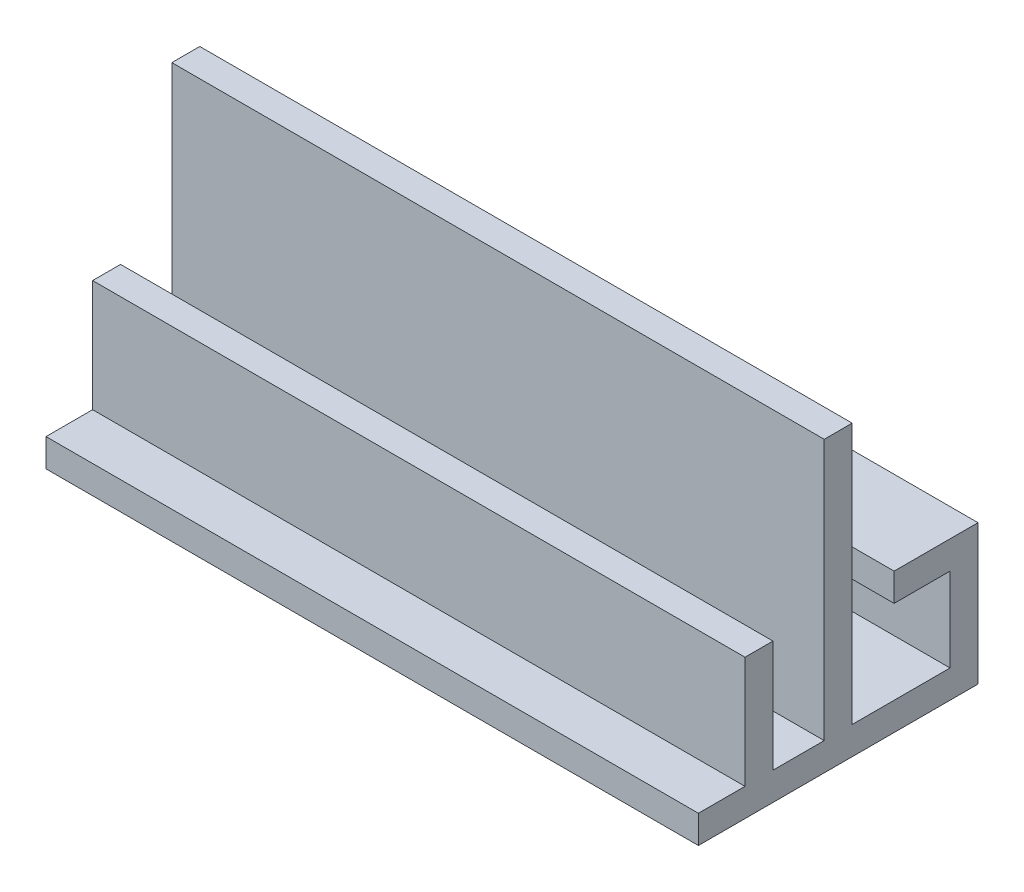
ISO-10303-21;
HEADER;
FILE_DESCRIPTION(('STEP AP214'),'2;1');
FILE_NAME('part.step','',(''),(''),'','','');
FILE_SCHEMA(('AUTOMOTIVE_DESIGN { 1 0 10303 214 1 1 1 1 }'));
ENDSEC;
DATA;
#1=APPLICATION_CONTEXT('core data for automotive mechanical design processes');
#2=APPLICATION_PROTOCOL_DEFINITION('international standard','automotive_design',2000,#1);
#3=PRODUCT_CONTEXT('',#1,'mechanical');
#4=PRODUCT('Part','Part','',(#3));
#5=PRODUCT_RELATED_PRODUCT_CATEGORY('part','',(#4));
#6=PRODUCT_DEFINITION_FORMATION('','',#4);
#7=PRODUCT_DEFINITION_CONTEXT('part definition',#1,'design');
#8=PRODUCT_DEFINITION('design','',#6,#7);
#9=PRODUCT_DEFINITION_SHAPE('','',#8);
#10=(LENGTH_UNIT() NAMED_UNIT(*) SI_UNIT(.MILLI.,.METRE.));
#11=(NAMED_UNIT(*) PLANE_ANGLE_UNIT() SI_UNIT($,.RADIAN.));
#12=(NAMED_UNIT(*) SI_UNIT($,.STERADIAN.) SOLID_ANGLE_UNIT());
#13=UNCERTAINTY_MEASURE_WITH_UNIT(LENGTH_MEASURE(1.E-05),#10,'distance_accuracy_value','');
#14=(GEOMETRIC_REPRESENTATION_CONTEXT(3) GLOBAL_UNCERTAINTY_ASSIGNED_CONTEXT((#13)) GLOBAL_UNIT_ASSIGNED_CONTEXT((#10,
#11,#12)) REPRESENTATION_CONTEXT('',''));
#15=CARTESIAN_POINT('',(0.,0.,0.));
#16=DIRECTION('',(0.,0.,1.));
#17=DIRECTION('',(1.,0.,0.));
#18=AXIS2_PLACEMENT_3D('',#15,#16,#17);
#19=CARTESIAN_POINT('',(70.,0.,9.99999999999999));
#20=DIRECTION('',(0.,0.,1.));
#21=DIRECTION('',(1.,0.,0.));
#22=AXIS2_PLACEMENT_3D('',#19,#20,#21);
#23=PLANE('',#22);
#24=DIRECTION('',(0.,1.,0.));
#25=VECTOR('',#24,1.);
#26=CARTESIAN_POINT('',(0.,0.,9.99999999999999));
#27=LINE('',#26,#25);
#28=CARTESIAN_POINT('',(0.,1.5,9.99999999999999));
#29=VERTEX_POINT('',#28);
#30=CARTESIAN_POINT('',(0.,13.5,9.99999999999999));
#31=VERTEX_POINT('',#30);
#32=EDGE_CURVE('E233',#29,#31,#27,.T.);
#33=ORIENTED_EDGE('',*,*,#32,.F.);
#34=DIRECTION('',(-1.,0.,0.));
#35=VECTOR('',#34,1.);
#36=CARTESIAN_POINT('',(70.,1.5,9.99999999999999));
#37=LINE('',#36,#35);
#38=CARTESIAN_POINT('',(70.,1.5,9.99999999999999));
#39=VERTEX_POINT('',#38);
#40=EDGE_CURVE('E11',#39,#29,#37,.T.);
#41=ORIENTED_EDGE('',*,*,#40,.F.);
#42=DIRECTION('',(0.,1.,0.));
#43=VECTOR('',#42,1.);
#44=CARTESIAN_POINT('',(70.,0.,9.99999999999999));
#45=LINE('',#44,#43);
#46=CARTESIAN_POINT('',(70.,13.5,9.99999999999999));
#47=VERTEX_POINT('',#46);
#48=EDGE_CURVE('E184',#39,#47,#45,.T.);
#49=ORIENTED_EDGE('',*,*,#48,.T.);
#50=DIRECTION('',(-1.,0.,0.));
#51=VECTOR('',#50,1.);
#52=CARTESIAN_POINT('',(70.,13.5,9.99999999999999));
#53=LINE('',#52,#51);
#54=EDGE_CURVE('E51',#47,#31,#53,.T.);
#55=ORIENTED_EDGE('',*,*,#54,.T.);
#56=EDGE_LOOP('',(#33,#41,#49,#55));
#57=FACE_BOUND('',#56,.T.);
#58=ADVANCED_FACE('F35',(#57),#23,.T.);
#59=CARTESIAN_POINT('',(70.,1.5,0.));
#60=DIRECTION('',(0.,1.,0.));
#61=DIRECTION('',(0.,0.,1.));
#62=AXIS2_PLACEMENT_3D('',#59,#60,#61);
#63=PLANE('',#62);
#64=DIRECTION('',(0.,0.,-1.));
#65=VECTOR('',#64,1.);
#66=CARTESIAN_POINT('',(0.,1.5,0.));
#67=LINE('',#66,#65);
#68=CARTESIAN_POINT('',(0.,1.5,15.));
#69=VERTEX_POINT('',#68);
#70=EDGE_CURVE('E231',#69,#29,#67,.T.);
#71=ORIENTED_EDGE('',*,*,#70,.F.);
#72=DIRECTION('',(-1.,0.,0.));
#73=VECTOR('',#72,1.);
#74=CARTESIAN_POINT('',(70.,1.5,15.));
#75=LINE('',#74,#73);
#76=CARTESIAN_POINT('',(70.,1.5,15.));
#77=VERTEX_POINT('',#76);
#78=EDGE_CURVE('E43',#77,#69,#75,.T.);
#79=ORIENTED_EDGE('',*,*,#78,.F.);
#80=DIRECTION('',(0.,0.,-1.));
#81=VECTOR('',#80,1.);
#82=CARTESIAN_POINT('',(70.,1.5,0.));
#83=LINE('',#82,#81);
#84=EDGE_CURVE('E174',#77,#39,#83,.T.);
#85=ORIENTED_EDGE('',*,*,#84,.T.);
#86=ORIENTED_EDGE('',*,*,#40,.T.);
#87=EDGE_LOOP('',(#71,#79,#85,#86));
#88=FACE_BOUND('',#87,.T.);
#89=ADVANCED_FACE('F232',(#88),#63,.T.);
#90=CARTESIAN_POINT('',(70.,0.,15.));
#91=DIRECTION('',(0.,0.,1.));
#92=DIRECTION('',(1.,0.,0.));
#93=AXIS2_PLACEMENT_3D('',#90,#91,#92);
#94=PLANE('',#93);
#95=DIRECTION('',(0.,1.,0.));
#96=VECTOR('',#95,1.);
#97=CARTESIAN_POINT('',(0.,0.,15.));
#98=LINE('',#97,#96);
#99=CARTESIAN_POINT('',(0.,-1.5,15.));
#100=VERTEX_POINT('',#99);
#101=EDGE_CURVE('E228',#100,#69,#98,.T.);
#102=ORIENTED_EDGE('',*,*,#101,.F.);
#103=DIRECTION('',(-1.,0.,0.));
#104=VECTOR('',#103,1.);
#105=CARTESIAN_POINT('',(70.,-1.5,15.));
#106=LINE('',#105,#104);
#107=CARTESIAN_POINT('',(70.,-1.5,15.));
#108=VERTEX_POINT('',#107);
#109=EDGE_CURVE('E222',#108,#100,#106,.T.);
#110=ORIENTED_EDGE('',*,*,#109,.F.);
#111=DIRECTION('',(0.,1.,0.));
#112=VECTOR('',#111,1.);
#113=CARTESIAN_POINT('',(70.,0.,15.));
#114=LINE('',#113,#112);
#115=EDGE_CURVE('E183',#108,#77,#114,.T.);
#116=ORIENTED_EDGE('',*,*,#115,.T.);
#117=ORIENTED_EDGE('',*,*,#78,.T.);
#118=EDGE_LOOP('',(#102,#110,#116,#117));
#119=FACE_BOUND('',#118,.T.);
#120=ADVANCED_FACE('F226',(#119),#94,.T.);
#121=CARTESIAN_POINT('',(70.,-1.5,0.));
#122=DIRECTION('',(0.,1.,0.));
#123=DIRECTION('',(0.,0.,1.));
#124=AXIS2_PLACEMENT_3D('',#121,#122,#123);
#125=PLANE('',#124);
#126=DIRECTION('',(0.,0.,-1.));
#127=VECTOR('',#126,1.);
#128=CARTESIAN_POINT('',(0.,-1.5,0.));
#129=LINE('',#128,#127);
#130=CARTESIAN_POINT('',(0.,-1.5,-15.));
#131=VERTEX_POINT('',#130);
#132=EDGE_CURVE('E239',#100,#131,#129,.T.);
#133=ORIENTED_EDGE('',*,*,#132,.T.);
#134=DIRECTION('',(-1.,0.,0.));
#135=VECTOR('',#134,1.);
#136=CARTESIAN_POINT('',(70.,-1.5,-15.));
#137=LINE('',#136,#135);
#138=CARTESIAN_POINT('',(70.,-1.5,-15.));
#139=VERTEX_POINT('',#138);
#140=EDGE_CURVE('E219',#139,#131,#137,.T.);
#141=ORIENTED_EDGE('',*,*,#140,.F.);
#142=DIRECTION('',(0.,0.,-1.));
#143=VECTOR('',#142,1.);
#144=CARTESIAN_POINT('',(70.,-1.5,0.));
#145=LINE('',#144,#143);
#146=EDGE_CURVE('E188',#108,#139,#145,.T.);
#147=ORIENTED_EDGE('',*,*,#146,.F.);
#148=ORIENTED_EDGE('',*,*,#109,.T.);
#149=EDGE_LOOP('',(#133,#141,#147,#148));
#150=FACE_BOUND('',#149,.T.);
#151=ADVANCED_FACE('F301',(#150),#125,.F.);
#152=CARTESIAN_POINT('',(70.,0.,-15.));
#153=DIRECTION('',(0.,0.,1.));
#154=DIRECTION('',(1.,0.,0.));
#155=AXIS2_PLACEMENT_3D('',#152,#153,#154);
#156=PLANE('',#155);
#157=DIRECTION('',(0.,1.,0.));
#158=VECTOR('',#157,1.);
#159=CARTESIAN_POINT('',(0.,0.,-15.));
#160=LINE('',#159,#158);
#161=CARTESIAN_POINT('',(0.,13.5,-15.));
#162=VERTEX_POINT('',#161);
#163=EDGE_CURVE('E241',#131,#162,#160,.T.);
#164=ORIENTED_EDGE('',*,*,#163,.T.);
#165=DIRECTION('',(-1.,0.,0.));
#166=VECTOR('',#165,1.);
#167=CARTESIAN_POINT('',(70.,13.5,-15.));
#168=LINE('',#167,#166);
#169=CARTESIAN_POINT('',(70.,13.5,-15.));
#170=VERTEX_POINT('',#169);
#171=EDGE_CURVE('E216',#170,#162,#168,.T.);
#172=ORIENTED_EDGE('',*,*,#171,.F.);
#173=DIRECTION('',(0.,1.,0.));
#174=VECTOR('',#173,1.);
#175=CARTESIAN_POINT('',(70.,0.,-15.));
#176=LINE('',#175,#174);
#177=EDGE_CURVE('E297',#139,#170,#176,.T.);
#178=ORIENTED_EDGE('',*,*,#177,.F.);
#179=ORIENTED_EDGE('',*,*,#140,.T.);
#180=EDGE_LOOP('',(#164,#172,#178,#179));
#181=FACE_BOUND('',#180,.T.);
#182=ADVANCED_FACE('F296',(#181),#156,.F.);
#183=CARTESIAN_POINT('',(70.,13.5,0.));
#184=DIRECTION('',(0.,-1.,0.));
#185=DIRECTION('',(0.,0.,-1.));
#186=AXIS2_PLACEMENT_3D('',#183,#184,#185);
#187=PLANE('',#186);
#188=DIRECTION('',(0.,0.,1.));
#189=VECTOR('',#188,1.);
#190=CARTESIAN_POINT('',(0.,13.5,0.));
#191=LINE('',#190,#189);
#192=CARTESIAN_POINT('',(0.,13.5,-6.00000000000001));
#193=VERTEX_POINT('',#192);
#194=EDGE_CURVE('E246',#162,#193,#191,.T.);
#195=ORIENTED_EDGE('',*,*,#194,.T.);
#196=DIRECTION('',(-1.,0.,0.));
#197=VECTOR('',#196,1.);
#198=CARTESIAN_POINT('',(70.,13.5,-6.00000000000001));
#199=LINE('',#198,#197);
#200=CARTESIAN_POINT('',(70.,13.5,-6.00000000000001));
#201=VERTEX_POINT('',#200);
#202=EDGE_CURVE('E213',#201,#193,#199,.T.);
#203=ORIENTED_EDGE('',*,*,#202,.F.);
#204=DIRECTION('',(0.,0.,1.));
#205=VECTOR('',#204,1.);
#206=CARTESIAN_POINT('',(70.,13.5,0.));
#207=LINE('',#206,#205);
#208=EDGE_CURVE('E292',#170,#201,#207,.T.);
#209=ORIENTED_EDGE('',*,*,#208,.F.);
#210=ORIENTED_EDGE('',*,*,#171,.T.);
#211=EDGE_LOOP('',(#195,#203,#209,#210));
#212=FACE_BOUND('',#211,.T.);
#213=ADVANCED_FACE('F291',(#212),#187,.F.);
#214=CARTESIAN_POINT('',(70.,0.,-6.00000000000001));
#215=DIRECTION('',(0.,0.,-1.));
#216=DIRECTION('',(0.,1.,0.));
#217=AXIS2_PLACEMENT_3D('',#214,#215,#216);
#218=PLANE('',#217);
#219=DIRECTION('',(0.,-1.,0.));
#220=VECTOR('',#219,1.);
#221=CARTESIAN_POINT('',(0.,0.,-6.00000000000001));
#222=LINE('',#221,#220);
#223=CARTESIAN_POINT('',(0.,10.5,-6.00000000000001));
#224=VERTEX_POINT('',#223);
#225=EDGE_CURVE('E248',#193,#224,#222,.T.);
#226=ORIENTED_EDGE('',*,*,#225,.T.);
#227=DIRECTION('',(-1.,0.,0.));
#228=VECTOR('',#227,1.);
#229=CARTESIAN_POINT('',(70.,10.5,-6.00000000000001));
#230=LINE('',#229,#228);
#231=CARTESIAN_POINT('',(70.,10.5,-6.00000000000001));
#232=VERTEX_POINT('',#231);
#233=EDGE_CURVE('E210',#232,#224,#230,.T.);
#234=ORIENTED_EDGE('',*,*,#233,.F.);
#235=DIRECTION('',(0.,-1.,0.));
#236=VECTOR('',#235,1.);
#237=CARTESIAN_POINT('',(70.,0.,-6.00000000000001));
#238=LINE('',#237,#236);
#239=EDGE_CURVE('E288',#201,#232,#238,.T.);
#240=ORIENTED_EDGE('',*,*,#239,.F.);
#241=ORIENTED_EDGE('',*,*,#202,.T.);
#242=EDGE_LOOP('',(#226,#234,#240,#241));
#243=FACE_BOUND('',#242,.T.);
#244=ADVANCED_FACE('F285',(#243),#218,.F.);
#245=CARTESIAN_POINT('',(70.,10.5,0.));
#246=DIRECTION('',(0.,1.,0.));
#247=DIRECTION('',(0.,0.,1.));
#248=AXIS2_PLACEMENT_3D('',#245,#246,#247);
#249=PLANE('',#248);
#250=DIRECTION('',(0.,0.,-1.));
#251=VECTOR('',#250,1.);
#252=CARTESIAN_POINT('',(0.,10.5,0.));
#253=LINE('',#252,#251);
#254=CARTESIAN_POINT('',(0.,10.5,-12.));
#255=VERTEX_POINT('',#254);
#256=EDGE_CURVE('E250',#224,#255,#253,.T.);
#257=ORIENTED_EDGE('',*,*,#256,.T.);
#258=DIRECTION('',(-1.,0.,0.));
#259=VECTOR('',#258,1.);
#260=CARTESIAN_POINT('',(70.,10.5,-12.));
#261=LINE('',#260,#259);
#262=CARTESIAN_POINT('',(70.,10.5,-12.));
#263=VERTEX_POINT('',#262);
#264=EDGE_CURVE('E208',#263,#255,#261,.T.);
#265=ORIENTED_EDGE('',*,*,#264,.F.);
#266=DIRECTION('',(0.,0.,-1.));
#267=VECTOR('',#266,1.);
#268=CARTESIAN_POINT('',(70.,10.5,0.));
#269=LINE('',#268,#267);
#270=EDGE_CURVE('E515',#232,#263,#269,.T.);
#271=ORIENTED_EDGE('',*,*,#270,.F.);
#272=ORIENTED_EDGE('',*,*,#233,.T.);
#273=EDGE_LOOP('',(#257,#265,#271,#272));
#274=FACE_BOUND('',#273,.T.);
#275=ADVANCED_FACE('F280',(#274),#249,.F.);
#276=CARTESIAN_POINT('',(70.,0.,-12.));
#277=DIRECTION('',(0.,0.,1.));
#278=DIRECTION('',(1.,0.,0.));
#279=AXIS2_PLACEMENT_3D('',#276,#277,#278);
#280=PLANE('',#279);
#281=DIRECTION('',(0.,1.,0.));
#282=VECTOR('',#281,1.);
#283=CARTESIAN_POINT('',(0.,0.,-12.));
#284=LINE('',#283,#282);
#285=CARTESIAN_POINT('',(0.,1.5,-12.));
#286=VERTEX_POINT('',#285);
#287=EDGE_CURVE('E253',#286,#255,#284,.T.);
#288=ORIENTED_EDGE('',*,*,#287,.F.);
#289=DIRECTION('',(-1.,0.,0.));
#290=VECTOR('',#289,1.);
#291=CARTESIAN_POINT('',(70.,1.5,-12.));
#292=LINE('',#291,#290);
#293=CARTESIAN_POINT('',(70.,1.5,-12.));
#294=VERTEX_POINT('',#293);
#295=EDGE_CURVE('E206',#294,#286,#292,.T.);
#296=ORIENTED_EDGE('',*,*,#295,.F.);
#297=DIRECTION('',(0.,1.,0.));
#298=VECTOR('',#297,1.);
#299=CARTESIAN_POINT('',(70.,0.,-12.));
#300=LINE('',#299,#298);
#301=EDGE_CURVE('E181',#294,#263,#300,.T.);
#302=ORIENTED_EDGE('',*,*,#301,.T.);
#303=ORIENTED_EDGE('',*,*,#264,.T.);
#304=EDGE_LOOP('',(#288,#296,#302,#303));
#305=FACE_BOUND('',#304,.T.);
#306=ADVANCED_FACE('F276',(#305),#280,.T.);
#307=CARTESIAN_POINT('',(0.,1.5,-1.5));
#308=VERTEX_POINT('',#307);
#309=EDGE_CURVE('E235',#308,#286,#67,.T.);
#310=ORIENTED_EDGE('',*,*,#309,.F.);
#311=DIRECTION('',(-1.,0.,0.));
#312=VECTOR('',#311,1.);
#313=CARTESIAN_POINT('',(70.,1.5,-1.5));
#314=LINE('',#313,#312);
#315=CARTESIAN_POINT('',(70.,1.5,-1.5));
#316=VERTEX_POINT('',#315);
#317=EDGE_CURVE('E204',#316,#308,#314,.T.);
#318=ORIENTED_EDGE('',*,*,#317,.F.);
#319=EDGE_CURVE('E173',#316,#294,#83,.T.);
#320=ORIENTED_EDGE('',*,*,#319,.T.);
#321=ORIENTED_EDGE('',*,*,#295,.T.);
#322=EDGE_LOOP('',(#310,#318,#320,#321));
#323=FACE_BOUND('',#322,.T.);
#324=ADVANCED_FACE('F271',(#323),#63,.T.);
#325=CARTESIAN_POINT('',(70.,0.,-1.5));
#326=DIRECTION('',(0.,0.,-1.));
#327=DIRECTION('',(0.,1.,0.));
#328=AXIS2_PLACEMENT_3D('',#325,#326,#327);
#329=PLANE('',#328);
#330=DIRECTION('',(0.,-1.,0.));
#331=VECTOR('',#330,1.);
#332=CARTESIAN_POINT('',(0.,0.,-1.5));
#333=LINE('',#332,#331);
#334=CARTESIAN_POINT('',(0.,29.5,-1.5));
#335=VERTEX_POINT('',#334);
#336=EDGE_CURVE('E256',#335,#308,#333,.T.);
#337=ORIENTED_EDGE('',*,*,#336,.F.);
#338=DIRECTION('',(-1.,0.,0.));
#339=VECTOR('',#338,1.);
#340=CARTESIAN_POINT('',(70.,29.5,-1.5));
#341=LINE('',#340,#339);
#342=CARTESIAN_POINT('',(70.,29.5,-1.5));
#343=VERTEX_POINT('',#342);
#344=EDGE_CURVE('E202',#343,#335,#341,.T.);
#345=ORIENTED_EDGE('',*,*,#344,.F.);
#346=DIRECTION('',(0.,-1.,0.));
#347=VECTOR('',#346,1.);
#348=CARTESIAN_POINT('',(70.,0.,-1.5));
#349=LINE('',#348,#347);
#350=EDGE_CURVE('E180',#343,#316,#349,.T.);
#351=ORIENTED_EDGE('',*,*,#350,.T.);
#352=ORIENTED_EDGE('',*,*,#317,.T.);
#353=EDGE_LOOP('',(#337,#345,#351,#352));
#354=FACE_BOUND('',#353,.T.);
#355=ADVANCED_FACE('F324',(#354),#329,.T.);
#356=CARTESIAN_POINT('',(70.,29.5,0.));
#357=DIRECTION('',(0.,1.,0.));
#358=DIRECTION('',(0.,0.,1.));
#359=AXIS2_PLACEMENT_3D('',#356,#357,#358);
#360=PLANE('',#359);
#361=DIRECTION('',(0.,0.,-1.));
#362=VECTOR('',#361,1.);
#363=CARTESIAN_POINT('',(0.,29.5,0.));
#364=LINE('',#363,#362);
#365=CARTESIAN_POINT('',(0.,29.5,1.5));
#366=VERTEX_POINT('',#365);
#367=EDGE_CURVE('E259',#366,#335,#364,.T.);
#368=ORIENTED_EDGE('',*,*,#367,.F.);
#369=DIRECTION('',(-1.,0.,0.));
#370=VECTOR('',#369,1.);
#371=CARTESIAN_POINT('',(70.,29.5,1.5));
#372=LINE('',#371,#370);
#373=CARTESIAN_POINT('',(70.,29.5,1.5));
#374=VERTEX_POINT('',#373);
#375=EDGE_CURVE('E200',#374,#366,#372,.T.);
#376=ORIENTED_EDGE('',*,*,#375,.F.);
#377=DIRECTION('',(0.,0.,-1.));
#378=VECTOR('',#377,1.);
#379=CARTESIAN_POINT('',(70.,29.5,0.));
#380=LINE('',#379,#378);
#381=EDGE_CURVE('E175',#374,#343,#380,.T.);
#382=ORIENTED_EDGE('',*,*,#381,.T.);
#383=ORIENTED_EDGE('',*,*,#344,.T.);
#384=EDGE_LOOP('',(#368,#376,#382,#383));
#385=FACE_BOUND('',#384,.T.);
#386=ADVANCED_FACE('F330',(#385),#360,.T.);
#387=CARTESIAN_POINT('',(70.,0.,1.5));
#388=DIRECTION('',(0.,0.,-1.));
#389=DIRECTION('',(0.,1.,0.));
#390=AXIS2_PLACEMENT_3D('',#387,#388,#389);
#391=PLANE('',#390);
#392=DIRECTION('',(0.,-1.,0.));
#393=VECTOR('',#392,1.);
#394=CARTESIAN_POINT('',(0.,0.,1.5));
#395=LINE('',#394,#393);
#396=CARTESIAN_POINT('',(0.,1.5,1.5));
#397=VERTEX_POINT('',#396);
#398=EDGE_CURVE('E261',#366,#397,#395,.T.);
#399=ORIENTED_EDGE('',*,*,#398,.T.);
#400=DIRECTION('',(-1.,0.,0.));
#401=VECTOR('',#400,1.);
#402=CARTESIAN_POINT('',(70.,1.5,1.5));
#403=LINE('',#402,#401);
#404=CARTESIAN_POINT('',(70.,1.5,1.5));
#405=VERTEX_POINT('',#404);
#406=EDGE_CURVE('E159',#405,#397,#403,.T.);
#407=ORIENTED_EDGE('',*,*,#406,.F.);
#408=DIRECTION('',(0.,-1.,0.));
#409=VECTOR('',#408,1.);
#410=CARTESIAN_POINT('',(70.,0.,1.5));
#411=LINE('',#410,#409);
#412=EDGE_CURVE('E170',#374,#405,#411,.T.);
#413=ORIENTED_EDGE('',*,*,#412,.F.);
#414=ORIENTED_EDGE('',*,*,#375,.T.);
#415=EDGE_LOOP('',(#399,#407,#413,#414));
#416=FACE_BOUND('',#415,.T.);
#417=ADVANCED_FACE('F326',(#416),#391,.F.);
#418=CARTESIAN_POINT('',(0.,1.5,6.99999999999999));
#419=VERTEX_POINT('',#418);
#420=EDGE_CURVE('E156',#419,#397,#67,.T.);
#421=ORIENTED_EDGE('',*,*,#420,.F.);
#422=DIRECTION('',(-1.,0.,0.));
#423=VECTOR('',#422,1.);
#424=CARTESIAN_POINT('',(70.,1.5,6.99999999999999));
#425=LINE('',#424,#423);
#426=CARTESIAN_POINT('',(70.,1.5,6.99999999999999));
#427=VERTEX_POINT('',#426);
#428=EDGE_CURVE('E150',#427,#419,#425,.T.);
#429=ORIENTED_EDGE('',*,*,#428,.F.);
#430=EDGE_CURVE('E154',#427,#405,#83,.T.);
#431=ORIENTED_EDGE('',*,*,#430,.T.);
#432=ORIENTED_EDGE('',*,*,#406,.T.);
#433=EDGE_LOOP('',(#421,#429,#431,#432));
#434=FACE_BOUND('',#433,.T.);
#435=ADVANCED_FACE('F152',(#434),#63,.T.);
#436=CARTESIAN_POINT('',(70.,0.,6.99999999999999));
#437=DIRECTION('',(0.,0.,1.));
#438=DIRECTION('',(1.,0.,0.));
#439=AXIS2_PLACEMENT_3D('',#436,#437,#438);
#440=PLANE('',#439);
#441=DIRECTION('',(0.,1.,0.));
#442=VECTOR('',#441,1.);
#443=CARTESIAN_POINT('',(0.,0.,6.99999999999999));
#444=LINE('',#443,#442);
#445=CARTESIAN_POINT('',(0.,13.5,6.99999999999999));
#446=VERTEX_POINT('',#445);
#447=EDGE_CURVE('E191',#419,#446,#444,.T.);
#448=ORIENTED_EDGE('',*,*,#447,.T.);
#449=DIRECTION('',(-1.,0.,0.));
#450=VECTOR('',#449,1.);
#451=CARTESIAN_POINT('',(70.,13.5,6.99999999999999));
#452=LINE('',#451,#450);
#453=CARTESIAN_POINT('',(70.,13.5,6.99999999999999));
#454=VERTEX_POINT('',#453);
#455=EDGE_CURVE('E101',#454,#446,#452,.T.);
#456=ORIENTED_EDGE('',*,*,#455,.F.);
#457=DIRECTION('',(0.,1.,0.));
#458=VECTOR('',#457,1.);
#459=CARTESIAN_POINT('',(70.,0.,6.99999999999999));
#460=LINE('',#459,#458);
#461=EDGE_CURVE('E161',#427,#454,#460,.T.);
#462=ORIENTED_EDGE('',*,*,#461,.F.);
#463=ORIENTED_EDGE('',*,*,#428,.T.);
#464=EDGE_LOOP('',(#448,#456,#462,#463));
#465=FACE_BOUND('',#464,.T.);
#466=ADVANCED_FACE('F162',(#465),#440,.F.);
#467=CARTESIAN_POINT('',(70.,13.5,0.));
#468=DIRECTION('',(0.,1.,0.));
#469=DIRECTION('',(0.,0.,1.));
#470=AXIS2_PLACEMENT_3D('',#467,#468,#469);
#471=PLANE('',#470);
#472=DIRECTION('',(0.,0.,-1.));
#473=VECTOR('',#472,1.);
#474=CARTESIAN_POINT('',(0.,13.5,0.));
#475=LINE('',#474,#473);
#476=EDGE_CURVE('E189',#31,#446,#475,.T.);
#477=ORIENTED_EDGE('',*,*,#476,.F.);
#478=ORIENTED_EDGE('',*,*,#54,.F.);
#479=DIRECTION('',(0.,0.,-1.));
#480=VECTOR('',#479,1.);
#481=CARTESIAN_POINT('',(70.,13.5,0.));
#482=LINE('',#481,#480);
#483=EDGE_CURVE('E165',#47,#454,#482,.T.);
#484=ORIENTED_EDGE('',*,*,#483,.T.);
#485=ORIENTED_EDGE('',*,*,#455,.T.);
#486=EDGE_LOOP('',(#477,#478,#484,#485));
#487=FACE_BOUND('',#486,.T.);
#488=ADVANCED_FACE('F304',(#487),#471,.T.);
#489=CARTESIAN_POINT('',(70.,0.,0.));
#490=DIRECTION('',(1.,0.,0.));
#491=DIRECTION('',(0.,0.,-1.));
#492=AXIS2_PLACEMENT_3D('',#489,#490,#491);
#493=PLANE('',#492);
#494=ORIENTED_EDGE('',*,*,#48,.F.);
#495=ORIENTED_EDGE('',*,*,#84,.F.);
#496=ORIENTED_EDGE('',*,*,#115,.F.);
#497=ORIENTED_EDGE('',*,*,#146,.T.);
#498=ORIENTED_EDGE('',*,*,#177,.T.);
#499=ORIENTED_EDGE('',*,*,#208,.T.);
#500=ORIENTED_EDGE('',*,*,#239,.T.);
#501=ORIENTED_EDGE('',*,*,#270,.T.);
#502=ORIENTED_EDGE('',*,*,#301,.F.);
#503=ORIENTED_EDGE('',*,*,#319,.F.);
#504=ORIENTED_EDGE('',*,*,#350,.F.);
#505=ORIENTED_EDGE('',*,*,#381,.F.);
#506=ORIENTED_EDGE('',*,*,#412,.T.);
#507=ORIENTED_EDGE('',*,*,#430,.F.);
#508=ORIENTED_EDGE('',*,*,#461,.T.);
#509=ORIENTED_EDGE('',*,*,#483,.F.);
#510=EDGE_LOOP('',(#494,#495,#496,#497,#498,#499,#500,#501,#502,#503,#504,#505,#506,#507,#508,#509));
#511=FACE_BOUND('',#510,.T.);
#512=ADVANCED_FACE('F167',(#511),#493,.T.);
#513=CARTESIAN_POINT('',(0.,0.,0.));
#514=DIRECTION('',(1.,0.,0.));
#515=DIRECTION('',(0.,0.,-1.));
#516=AXIS2_PLACEMENT_3D('',#513,#514,#515);
#517=PLANE('',#516);
#518=ORIENTED_EDGE('',*,*,#32,.T.);
#519=ORIENTED_EDGE('',*,*,#476,.T.);
#520=ORIENTED_EDGE('',*,*,#447,.F.);
#521=ORIENTED_EDGE('',*,*,#420,.T.);
#522=ORIENTED_EDGE('',*,*,#398,.F.);
#523=ORIENTED_EDGE('',*,*,#367,.T.);
#524=ORIENTED_EDGE('',*,*,#336,.T.);
#525=ORIENTED_EDGE('',*,*,#309,.T.);
#526=ORIENTED_EDGE('',*,*,#287,.T.);
#527=ORIENTED_EDGE('',*,*,#256,.F.);
#528=ORIENTED_EDGE('',*,*,#225,.F.);
#529=ORIENTED_EDGE('',*,*,#194,.F.);
#530=ORIENTED_EDGE('',*,*,#163,.F.);
#531=ORIENTED_EDGE('',*,*,#132,.F.);
#532=ORIENTED_EDGE('',*,*,#101,.T.);
#533=ORIENTED_EDGE('',*,*,#70,.T.);
#534=EDGE_LOOP('',(#518,#519,#520,#521,#522,#523,#524,#525,#526,#527,#528,#529,#530,#531,#532,#533));
#535=FACE_BOUND('',#534,.T.);
#536=ADVANCED_FACE('F237',(#535),#517,.F.);
#537=CLOSED_SHELL('',(#58,#89,#120,#151,#182,#213,#244,#275,#306,#324,#355,#386,#417,#435,#466,
#488,#512,#536));
#538=MANIFOLD_SOLID_BREP('B2',#537);
#539=ADVANCED_BREP_SHAPE_REPRESENTATION('',(#18,#538),#14);
#540=SHAPE_DEFINITION_REPRESENTATION(#9,#539);
ENDSEC;
END-ISO-10303-21;
